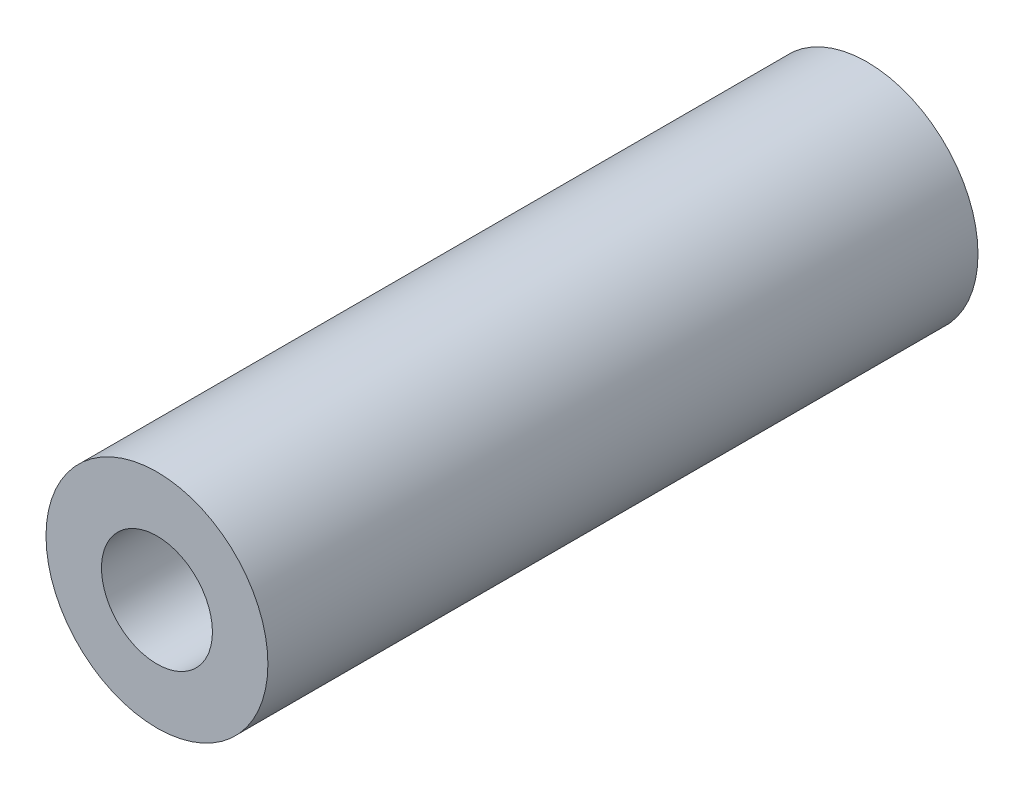
ISO-10303-21;
HEADER;
FILE_DESCRIPTION(('STEP AP214'),'2;1');
FILE_NAME('part.step','',(''),(''),'','','');
FILE_SCHEMA(('AUTOMOTIVE_DESIGN { 1 0 10303 214 1 1 1 1 }'));
ENDSEC;
DATA;
#1=APPLICATION_CONTEXT('core data for automotive mechanical design processes');
#2=APPLICATION_PROTOCOL_DEFINITION('international standard','automotive_design',2000,#1);
#3=PRODUCT_CONTEXT('',#1,'mechanical');
#4=PRODUCT('Part','Part','',(#3));
#5=PRODUCT_RELATED_PRODUCT_CATEGORY('part','',(#4));
#6=PRODUCT_DEFINITION_FORMATION('','',#4);
#7=PRODUCT_DEFINITION_CONTEXT('part definition',#1,'design');
#8=PRODUCT_DEFINITION('design','',#6,#7);
#9=PRODUCT_DEFINITION_SHAPE('','',#8);
#10=(LENGTH_UNIT() NAMED_UNIT(*) SI_UNIT(.MILLI.,.METRE.));
#11=(NAMED_UNIT(*) PLANE_ANGLE_UNIT() SI_UNIT($,.RADIAN.));
#12=(NAMED_UNIT(*) SI_UNIT($,.STERADIAN.) SOLID_ANGLE_UNIT());
#13=UNCERTAINTY_MEASURE_WITH_UNIT(LENGTH_MEASURE(1.E-05),#10,'distance_accuracy_value','');
#14=(GEOMETRIC_REPRESENTATION_CONTEXT(3) GLOBAL_UNCERTAINTY_ASSIGNED_CONTEXT((#13)) GLOBAL_UNIT_ASSIGNED_CONTEXT((#10,
#11,#12)) REPRESENTATION_CONTEXT('',''));
#15=CARTESIAN_POINT('',(0.,0.,0.));
#16=DIRECTION('',(0.,0.,1.));
#17=DIRECTION('',(1.,0.,0.));
#18=AXIS2_PLACEMENT_3D('',#15,#16,#17);
#19=CARTESIAN_POINT('',(0.,0.,-16.));
#20=DIRECTION('',(0.,0.,1.));
#21=DIRECTION('',(1.,0.,0.));
#22=AXIS2_PLACEMENT_3D('',#19,#20,#21);
#23=CYLINDRICAL_SURFACE('',#22,2.5);
#24=CARTESIAN_POINT('',(0.,0.,-16.));
#25=DIRECTION('',(0.,0.,1.));
#26=DIRECTION('',(1.,0.,0.));
#27=AXIS2_PLACEMENT_3D('',#24,#25,#26);
#28=CIRCLE('',#27,2.5);
#29=CARTESIAN_POINT('',(2.5,0.,-16.));
#30=VERTEX_POINT('',#29);
#31=EDGE_CURVE('E10',#30,#30,#28,.T.);
#32=ORIENTED_EDGE('',*,*,#31,.T.);
#33=EDGE_LOOP('',(#32));
#34=FACE_BOUND('',#33,.T.);
#35=CARTESIAN_POINT('',(0.,0.,0.));
#36=DIRECTION('',(0.,0.,1.));
#37=DIRECTION('',(1.,0.,0.));
#38=AXIS2_PLACEMENT_3D('',#35,#36,#37);
#39=CIRCLE('',#38,2.5);
#40=CARTESIAN_POINT('',(2.5,0.,0.));
#41=VERTEX_POINT('',#40);
#42=EDGE_CURVE('E42',#41,#41,#39,.T.);
#43=ORIENTED_EDGE('',*,*,#42,.F.);
#44=EDGE_LOOP('',(#43));
#45=FACE_BOUND('',#44,.T.);
#46=ADVANCED_FACE('F39',(#34,#45),#23,.T.);
#47=CARTESIAN_POINT('',(0.,0.,-16.));
#48=DIRECTION('',(0.,0.,1.));
#49=DIRECTION('',(1.,0.,0.));
#50=AXIS2_PLACEMENT_3D('',#47,#48,#49);
#51=PLANE('',#50);
#52=CARTESIAN_POINT('',(0.,0.,-16.));
#53=DIRECTION('',(0.,0.,1.));
#54=DIRECTION('',(1.,0.,0.));
#55=AXIS2_PLACEMENT_3D('',#52,#53,#54);
#56=CIRCLE('',#55,1.25);
#57=CARTESIAN_POINT('',(1.25,0.,-16.));
#58=VERTEX_POINT('',#57);
#59=EDGE_CURVE('E51',#58,#58,#56,.T.);
#60=ORIENTED_EDGE('',*,*,#59,.T.);
#61=EDGE_LOOP('',(#60));
#62=FACE_BOUND('',#61,.T.);
#63=ORIENTED_EDGE('',*,*,#31,.F.);
#64=EDGE_LOOP('',(#63));
#65=FACE_BOUND('',#64,.T.);
#66=ADVANCED_FACE('F61',(#62,#65),#51,.F.);
#67=CARTESIAN_POINT('',(0.,0.,0.));
#68=DIRECTION('',(0.,0.,1.));
#69=DIRECTION('',(1.,0.,0.));
#70=AXIS2_PLACEMENT_3D('',#67,#68,#69);
#71=PLANE('',#70);
#72=CARTESIAN_POINT('',(0.,0.,0.));
#73=DIRECTION('',(0.,0.,1.));
#74=DIRECTION('',(1.,0.,0.));
#75=AXIS2_PLACEMENT_3D('',#72,#73,#74);
#76=CIRCLE('',#75,1.25);
#77=CARTESIAN_POINT('',(1.25,0.,0.));
#78=VERTEX_POINT('',#77);
#79=EDGE_CURVE('E53',#78,#78,#76,.T.);
#80=ORIENTED_EDGE('',*,*,#79,.F.);
#81=EDGE_LOOP('',(#80));
#82=FACE_BOUND('',#81,.T.);
#83=ORIENTED_EDGE('',*,*,#42,.T.);
#84=EDGE_LOOP('',(#83));
#85=FACE_BOUND('',#84,.T.);
#86=ADVANCED_FACE('F67',(#82,#85),#71,.T.);
#87=CARTESIAN_POINT('',(0.,0.,-16.));
#88=DIRECTION('',(0.,0.,1.));
#89=DIRECTION('',(1.,0.,0.));
#90=AXIS2_PLACEMENT_3D('',#87,#88,#89);
#91=CYLINDRICAL_SURFACE('',#90,1.25);
#92=ORIENTED_EDGE('',*,*,#59,.F.);
#93=EDGE_LOOP('',(#92));
#94=FACE_BOUND('',#93,.T.);
#95=ORIENTED_EDGE('',*,*,#79,.T.);
#96=EDGE_LOOP('',(#95));
#97=FACE_BOUND('',#96,.T.);
#98=ADVANCED_FACE('F64',(#94,#97),#91,.F.);
#99=CLOSED_SHELL('',(#46,#66,#86,#98));
#100=MANIFOLD_SOLID_BREP('B2',#99);
#101=ADVANCED_BREP_SHAPE_REPRESENTATION('',(#18,#100),#14);
#102=SHAPE_DEFINITION_REPRESENTATION(#9,#101);
ENDSEC;
END-ISO-10303-21;
